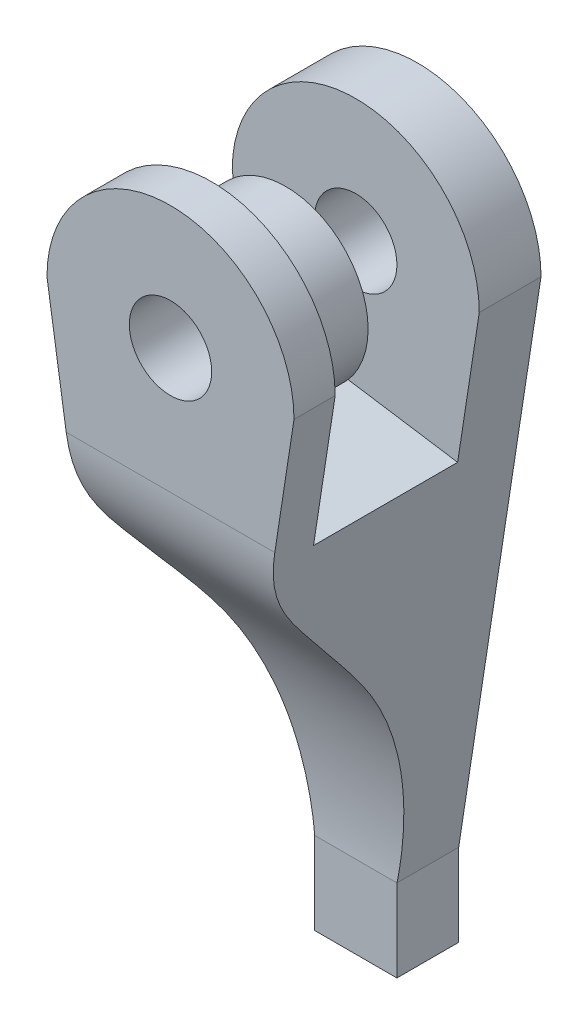
ISO-10303-21;
HEADER;
FILE_DESCRIPTION(('STEP AP214'),'2;1');
FILE_NAME('part.step','',(''),(''),'','','');
FILE_SCHEMA(('AUTOMOTIVE_DESIGN { 1 0 10303 214 1 1 1 1 }'));
ENDSEC;
DATA;
#1=APPLICATION_CONTEXT('core data for automotive mechanical design processes');
#2=APPLICATION_PROTOCOL_DEFINITION('international standard','automotive_design',2000,#1);
#3=PRODUCT_CONTEXT('',#1,'mechanical');
#4=PRODUCT('Part','Part','',(#3));
#5=PRODUCT_RELATED_PRODUCT_CATEGORY('part','',(#4));
#6=PRODUCT_DEFINITION_FORMATION('','',#4);
#7=PRODUCT_DEFINITION_CONTEXT('part definition',#1,'design');
#8=PRODUCT_DEFINITION('design','',#6,#7);
#9=PRODUCT_DEFINITION_SHAPE('','',#8);
#10=(LENGTH_UNIT() NAMED_UNIT(*) SI_UNIT(.MILLI.,.METRE.));
#11=(NAMED_UNIT(*) PLANE_ANGLE_UNIT() SI_UNIT($,.RADIAN.));
#12=(NAMED_UNIT(*) SI_UNIT($,.STERADIAN.) SOLID_ANGLE_UNIT());
#13=UNCERTAINTY_MEASURE_WITH_UNIT(LENGTH_MEASURE(1.E-05),#10,'distance_accuracy_value','');
#14=(GEOMETRIC_REPRESENTATION_CONTEXT(3) GLOBAL_UNCERTAINTY_ASSIGNED_CONTEXT((#13)) GLOBAL_UNIT_ASSIGNED_CONTEXT((#10,
#11,#12)) REPRESENTATION_CONTEXT('',''));
#15=CARTESIAN_POINT('',(0.,0.,0.));
#16=DIRECTION('',(0.,0.,1.));
#17=DIRECTION('',(1.,0.,0.));
#18=AXIS2_PLACEMENT_3D('',#15,#16,#17);
#19=CARTESIAN_POINT('',(0.,0.,25.));
#20=DIRECTION('',(0.,0.,1.));
#21=DIRECTION('',(1.,0.,0.));
#22=AXIS2_PLACEMENT_3D('',#19,#20,#21);
#23=PLANE('',#22);
#24=DIRECTION('',(-0.152057184253941,-0.988371697650617,0.));
#25=VECTOR('',#24,1.);
#26=CARTESIAN_POINT('',(14.6531791907514,-2.25433526011561,25.));
#27=LINE('',#26,#25);
#28=CARTESIAN_POINT('',(15.,0.,25.));
#29=VERTEX_POINT('',#28);
#30=CARTESIAN_POINT('',(12.3723214269423,-17.0799107248749,25.));
#31=VERTEX_POINT('',#30);
#32=EDGE_CURVE('E182',#29,#31,#27,.T.);
#33=ORIENTED_EDGE('',*,*,#32,.T.);
#34=DIRECTION('',(-0.988371697650617,0.152057184253941,0.));
#35=VECTOR('',#34,1.);
#36=CARTESIAN_POINT('',(-2.28085776380912,-14.8255754647593,25.));
#37=LINE('',#36,#35);
#38=CARTESIAN_POINT('',(-12.9721915567335,-13.1807548812324,25.));
#39=VERTEX_POINT('',#38);
#40=EDGE_CURVE('E206',#31,#39,#37,.T.);
#41=ORIENTED_EDGE('',*,*,#40,.T.);
#42=DIRECTION('',(0.152057184253941,-0.988371697650617,0.));
#43=VECTOR('',#42,1.);
#44=CARTESIAN_POINT('',(-14.6531791907514,-2.25433526011561,25.));
#45=LINE('',#44,#43);
#46=CARTESIAN_POINT('',(-15.,0.,25.));
#47=VERTEX_POINT('',#46);
#48=EDGE_CURVE('E201',#47,#39,#45,.T.);
#49=ORIENTED_EDGE('',*,*,#48,.F.);
#50=CARTESIAN_POINT('',(0.,0.,25.));
#51=DIRECTION('',(0.,0.,1.));
#52=DIRECTION('',(1.,0.,0.));
#53=AXIS2_PLACEMENT_3D('',#50,#51,#52);
#54=CIRCLE('',#53,15.);
#55=EDGE_CURVE('E199',#29,#47,#54,.T.);
#56=ORIENTED_EDGE('',*,*,#55,.F.);
#57=EDGE_LOOP('',(#33,#41,#49,#56));
#58=FACE_BOUND('',#57,.T.);
#59=CARTESIAN_POINT('',(0.,0.,25.));
#60=DIRECTION('',(0.,0.,1.));
#61=DIRECTION('',(1.,0.,0.));
#62=AXIS2_PLACEMENT_3D('',#59,#60,#61);
#63=CIRCLE('',#62,10.);
#64=CARTESIAN_POINT('',(10.,0.,25.));
#65=VERTEX_POINT('',#64);
#66=EDGE_CURVE('E13',#65,#65,#63,.F.);
#67=ORIENTED_EDGE('',*,*,#66,.F.);
#68=EDGE_LOOP('',(#67));
#69=FACE_BOUND('',#68,.T.);
#70=ADVANCED_FACE('F45',(#58,#69),#23,.F.);
#71=CARTESIAN_POINT('',(-14.6531791907514,-2.25433526011561,7.5));
#72=DIRECTION('',(0.988371697650617,0.152057184253941,0.));
#73=DIRECTION('',(-0.152057184253941,0.988371697650617,0.));
#74=AXIS2_PLACEMENT_3D('',#71,#72,#73);
#75=PLANE('',#74);
#76=CARTESIAN_POINT('',(-12.6651574370475,-15.1764766591914,30.));
#77=CARTESIAN_POINT('',(-12.6309229013846,-15.3990011410001,30.0000104255594));
#78=CARTESIAN_POINT('',(-12.5966856967954,-15.6215429708296,29.9955409957386));
#79=CARTESIAN_POINT('',(-12.5282575948815,-16.0663256332705,29.9772775209557));
#80=CARTESIAN_POINT('',(-12.4940667172222,-16.2885663380555,29.9634803110557));
#81=CARTESIAN_POINT('',(-12.4258052492918,-16.7322658796032,29.9261953290666));
#82=CARTESIAN_POINT('',(-12.3917346625539,-16.9537246933994,29.9027072746773));
#83=CARTESIAN_POINT('',(-12.3237886074102,-17.3953740518336,29.8457763560617));
#84=CARTESIAN_POINT('',(-12.2899131229269,-17.6155647009749,29.8123343244139));
#85=CARTESIAN_POINT('',(-12.2234103102979,-18.0478329830635,29.7364459358125));
#86=CARTESIAN_POINT('',(-12.1907753322971,-18.2599603400689,29.6942897024932));
#87=CARTESIAN_POINT('',(-12.1258308637561,-18.6820993855851,29.6003945796539));
#88=CARTESIAN_POINT('',(-12.0935213222334,-18.8921114054829,29.5486572165221));
#89=CARTESIAN_POINT('',(-12.0292919525398,-19.3096023084916,29.43567066459));
#90=CARTESIAN_POINT('',(-11.9973720930672,-19.5170813950633,29.3744222452717));
#91=CARTESIAN_POINT('',(-11.9339813595012,-19.9291211632422,29.2426049671905));
#92=CARTESIAN_POINT('',(-11.9025104783418,-20.1336818907782,29.1720362552892));
#93=CARTESIAN_POINT('',(-11.8399035144053,-20.5406271563654,29.0214912831394));
#94=CARTESIAN_POINT('',(-11.8087701123552,-20.7429942696908,28.941466857053));
#95=CARTESIAN_POINT('',(-11.7470480868656,-21.1441874353734,28.7727373912652));
#96=CARTESIAN_POINT('',(-11.7164595355517,-21.3430130189142,28.6840312122483));
#97=CARTESIAN_POINT('',(-11.6558590984265,-21.736915860228,28.4984801162571));
#98=CARTESIAN_POINT('',(-11.6258472216079,-21.9319930595484,28.4016350724915));
#99=CARTESIAN_POINT('',(-11.5664240616299,-22.3182435994059,28.200460367186));
#100=CARTESIAN_POINT('',(-11.5370125671996,-22.5094183132027,28.0961333989162));
#101=CARTESIAN_POINT('',(-11.4784695608721,-22.8899478543314,27.8795092363037));
#102=CARTESIAN_POINT('',(-11.4493442469285,-23.0792623949646,27.7671397567987));
#103=CARTESIAN_POINT('',(-11.3916759039723,-23.4541066241802,27.5361787600556));
#104=CARTESIAN_POINT('',(-11.3631328072633,-23.6396367527886,27.417587971983));
#105=CARTESIAN_POINT('',(-11.3065861696679,-24.0071898971587,27.1749308705608));
#106=CARTESIAN_POINT('',(-11.2785826977351,-24.1892124647218,27.050863864034));
#107=CARTESIAN_POINT('',(-11.2230672924181,-24.5500625992824,26.7980566291622));
#108=CARTESIAN_POINT('',(-11.1955553839472,-24.7288900043431,26.6693161649543));
#109=CARTESIAN_POINT('',(-11.1250500859062,-25.1871744416097,26.3317955004779));
#110=CARTESIAN_POINT('',(-11.0823797442674,-25.4645316622619,26.1201001296326));
#111=CARTESIAN_POINT('',(-11.0189443528452,-25.8768617065062,25.7977154527078));
#112=CARTESIAN_POINT('',(-10.9978924161289,-26.0136992951621,25.6894372210239));
#113=CARTESIAN_POINT('',(-10.9559321332563,-26.2864411338341,25.4716822365074));
#114=CARTESIAN_POINT('',(-10.9350237870021,-26.4223453844863,25.3622054844916));
#115=CARTESIAN_POINT('',(-10.8933024189929,-26.6935342765463,25.1425093156595));
#116=CARTESIAN_POINT('',(-10.8724893849346,-26.828818997925,25.0322899995101));
#117=CARTESIAN_POINT('',(-10.8309072519762,-27.099102862155,24.8114940224908));
#118=CARTESIAN_POINT('',(-10.8101381530034,-27.2341020054778,24.7009173622114));
#119=CARTESIAN_POINT('',(-10.7686462857886,-27.5037991423739,24.47940896942));
#120=CARTESIAN_POINT('',(-10.7479235142877,-27.6384971571297,24.3684772633092));
#121=CARTESIAN_POINT('',(-10.7065190013784,-27.9076264910401,24.1462834214081));
#122=CARTESIAN_POINT('',(-10.6858372599469,-28.0420578103449,24.035021285804));
#123=CARTESIAN_POINT('',(-10.6238196630834,-28.4451721899577,23.7006154658293));
#124=CARTESIAN_POINT('',(-10.5825411940378,-28.7134822387543,23.4770113612894));
#125=CARTESIAN_POINT('',(-10.5001083245377,-29.2492958905052,23.0288079797156));
#126=CARTESIAN_POINT('',(-10.4589539261535,-29.5167994800022,22.804208686228));
#127=CARTESIAN_POINT('',(-10.3766959049752,-30.0514766176614,22.354061438841));
#128=CARTESIAN_POINT('',(-10.3355923736116,-30.3186495715244,22.12851276276));
#129=CARTESIAN_POINT('',(-10.2534389301924,-30.8526469537492,21.6769959736275));
#130=CARTESIAN_POINT('',(-10.2123890179354,-31.1194713834201,21.4510278621592));
#131=CARTESIAN_POINT('',(-10.1302474817904,-31.6533913683621,20.99873624199));
#132=CARTESIAN_POINT('',(-10.0891558696047,-31.9204868475692,20.772412641092));
#133=CARTESIAN_POINT('',(-10.0069311624002,-32.454947444399,20.3200916656417));
#134=CARTESIAN_POINT('',(-9.96579806733101,-32.7223125623485,20.0940942914856));
#135=CARTESIAN_POINT('',(-9.84213215886628,-33.5261409673692,19.4165830604753));
#136=CARTESIAN_POINT('',(-9.75945303342924,-34.0635552827099,18.9662168320071));
#137=CARTESIAN_POINT('',(-9.5942250569529,-35.1375371298061,18.0785817440321));
#138=CARTESIAN_POINT('',(-9.51168789464864,-35.6740286847839,17.6412191808639));
#139=CARTESIAN_POINT('',(-9.34506239736745,-36.7570944171115,16.7789838443693));
#140=CARTESIAN_POINT('',(-9.26097360194631,-37.303671587349,16.3541148787525));
#141=CARTESIAN_POINT('',(-9.13324216415133,-38.1339259330164,15.7317504802914));
#142=CARTESIAN_POINT('',(-9.09042701209726,-38.4122244213678,15.5269139144095));
#143=CARTESIAN_POINT('',(-9.00415942117633,-38.9729637623538,15.1231185972565));
#144=CARTESIAN_POINT('',(-8.96070699617631,-39.255404524854,14.9241597183722));
#145=CARTESIAN_POINT('',(-8.89502613643056,-39.6823301132014,14.6311410218222));
#146=CARTESIAN_POINT('',(-8.87306824536463,-39.8250564051299,14.5344536337974));
#147=CARTESIAN_POINT('',(-8.82896779264746,-40.1117093477915,14.3429179941947));
#148=CARTESIAN_POINT('',(-8.80682523087647,-40.255635999303,14.2480697438095));
#149=CARTESIAN_POINT('',(-8.74012731594618,-40.6891724463498,13.9662852397961));
#150=CARTESIAN_POINT('',(-8.69530147279287,-40.9805404268464,13.7821080713406));
#151=CARTESIAN_POINT('',(-8.60501034519747,-41.5674327562165,13.4214546106705));
#152=CARTESIAN_POINT('',(-8.55954586006673,-41.8629519095663,13.2449696602624));
#153=CARTESIAN_POINT('',(-8.46795782064304,-42.4582741658202,12.899573908218));
#154=CARTESIAN_POINT('',(-8.42183426477593,-42.7580772789565,12.7306631246762));
#155=CARTESIAN_POINT('',(-8.28255801120975,-43.6633729271366,12.2355640563298));
#156=CARTESIAN_POINT('',(-8.18845482441539,-44.2750436413,11.9208297517456));
#157=CARTESIAN_POINT('',(-8.01604016563454,-45.3957389233755,11.3792455240864));
#158=CARTESIAN_POINT('',(-7.93811485997689,-45.9022534101502,11.1470427935834));
#159=CARTESIAN_POINT('',(-7.7808491348492,-46.9244806234802,10.703121373699));
#160=CARTESIAN_POINT('',(-7.70150761009294,-47.4402005343959,10.4914195934451));
#161=CARTESIAN_POINT('',(-7.54159169491173,-48.4796539830737,10.0888058500821));
#162=CARTESIAN_POINT('',(-7.46101698906223,-49.0033895710955,9.89789931089816));
#163=CARTESIAN_POINT('',(-7.29832140237487,-50.0609108845634,9.535972252223));
#164=CARTESIAN_POINT('',(-7.21619426990896,-50.5947372455918,9.36507328967339));
#165=CARTESIAN_POINT('',(-7.05101777044317,-51.6683844921194,9.04455895703785));
#166=CARTESIAN_POINT('',(-6.96796874099825,-52.2082031835114,8.89493605687927));
#167=CARTESIAN_POINT('',(-6.80107095809108,-53.293038772408,8.6169797271204));
#168=CARTESIAN_POINT('',(-6.71722239694794,-53.8380544198385,8.48864130787825));
#169=CARTESIAN_POINT('',(-6.56657268444818,-54.8172775510869,8.27808581887361));
#170=CARTESIAN_POINT('',(-6.49990069665785,-55.250645471724,8.19184790735053));
#171=CARTESIAN_POINT('',(-6.36618862801504,-56.1197739179023,8.03274210915712));
#172=CARTESIAN_POINT('',(-6.2991485497075,-56.5555344269013,7.95987413016807));
#173=CARTESIAN_POINT('',(-6.16489785168642,-57.4281639640383,7.82777982814137));
#174=CARTESIAN_POINT('',(-6.09768785637851,-57.8650289335397,7.7685260543494));
#175=CARTESIAN_POINT('',(-5.96302165895253,-58.7403592168086,7.66370145921284));
#176=CARTESIAN_POINT('',(-5.89556545907953,-59.1788245159831,7.6181305134121));
#177=CARTESIAN_POINT('',(-5.75939981419934,-60.0639012077043,7.54045760257651));
#178=CARTESIAN_POINT('',(-5.69068740758586,-60.5105318506919,7.50857982208973));
#179=CARTESIAN_POINT('',(-5.55312027983909,-61.4047181810459,7.46004039294758));
#180=CARTESIAN_POINT('',(-5.48426553197717,-61.8522740421484,7.44338192402294));
#181=CARTESIAN_POINT('',(-5.38078912226615,-62.52487070527,7.43084491072538));
#182=CARTESIAN_POINT('',(-5.34618310881751,-62.7498097926862,7.42875086177981));
#183=CARTESIAN_POINT('',(-5.27697581772415,-63.199657184793,7.4290797663929));
#184=CARTESIAN_POINT('',(-5.24237454018566,-63.4245654887932,7.43150201323426));
#185=CARTESIAN_POINT('',(-5.1904524420599,-63.7620591266106,7.43892103717431));
#186=CARTESIAN_POINT('',(-5.17312504424518,-63.8746872124063,7.44202980294997));
#187=CARTESIAN_POINT('',(-5.13847730679174,-64.0998975058537,7.4496225068762));
#188=CARTESIAN_POINT('',(-5.12115696703018,-64.2124797143038,7.45410641997236));
#189=CARTESIAN_POINT('',(-5.09518236895227,-64.3813146018103,7.46198364601045));
#190=CARTESIAN_POINT('',(-5.08652401323701,-64.4375939139594,7.46480172842067));
#191=CARTESIAN_POINT('',(-5.06921059020001,-64.5501311636999,7.47085067227776));
#192=CARTESIAN_POINT('',(-5.06055552288229,-64.6063891012651,7.4740815342285));
#193=CARTESIAN_POINT('',(-5.04757588258112,-64.6907567632227,7.47925989830149));
#194=CARTESIAN_POINT('',(-5.04324976561141,-64.7188765235258,7.48104139351356));
#195=CARTESIAN_POINT('',(-5.03459861383483,-64.7751090100736,7.48471701614256));
#196=CARTESIAN_POINT('',(-5.0302735790336,-64.8032217362816,7.48661114413404));
#197=CARTESIAN_POINT('',(-5.023786850539,-64.8453854714965,7.48953130077695));
#198=CARTESIAN_POINT('',(-5.02162474468496,-64.8594391595478,7.49051784724627));
#199=CARTESIAN_POINT('',(-5.01730074962156,-64.8875451274599,7.49251026660246));
#200=CARTESIAN_POINT('',(-5.0151388604117,-64.901597407324,7.49351613944462));
#201=CARTESIAN_POINT('',(-5.01081518370422,-64.9297013059225,7.4955397326945));
#202=CARTESIAN_POINT('',(-5.0086533962069,-64.9437529246552,7.49655745313388));
#203=CARTESIAN_POINT('',(-5.00541013744108,-64.964834106633,7.49802792885024));
#204=CARTESIAN_POINT('',(-5.00432893944892,-64.9718618935821,7.49850874308072));
#205=CARTESIAN_POINT('',(-5.00270666592642,-64.9824066714783,7.49919299636495));
#206=CARTESIAN_POINT('',(-5.00216581054672,-64.9859222314464,7.49941492626098));
#207=CARTESIAN_POINT('',(-5.0010834687422,-64.9929574531757,7.49978159809259));
#208=CARTESIAN_POINT('',(-5.00054198225216,-64.996477115361,7.49992633117814));
#209=CARTESIAN_POINT('',(-5.,-65.,7.5));
#210=B_SPLINE_CURVE_WITH_KNOTS('',3,(#76,#77,#78,#79,#80,#81,#82,#83,#84,#85,#86,#87,#88,#89,
#90,#91,#92,#93,#94,#95,#96,#97,#98,#99,#100,#101,#102,#103,#104,#105,#106,#107,#108,#109,#110,
#111,#112,#113,#114,#115,#116,#117,#118,#119,#120,#121,#122,#123,#124,#125,#126,#127,#128,#129,
#130,#131,#132,#133,#134,#135,#136,#137,#138,#139,#140,#141,#142,#143,#144,#145,#146,#147,#148,
#149,#150,#151,#152,#153,#154,#155,#156,#157,#158,#159,#160,#161,#162,#163,#164,#165,#166,#167,
#168,#169,#170,#171,#172,#173,#174,#175,#176,#177,#178,#179,#180,#181,#182,#183,#184,#185,#186,
#187,#188,#189,#190,#191,#192,#193,#194,#195,#196,#197,#198,#199,#200,#201,#202,#203,#204,#205,
#206,#207,#208,#209),.UNSPECIFIED.,.F.,.F.,(4,2,2,2,2,2,2,2,2,2,2,2,2,2,2,2,2,2,2,2,2,2,2,2,2,2,
2,2,2,2,2,2,2,2,2,2,2,2,2,2,2,2,2,2,2,2,2,2,2,2,2,2,2,2,2,2,2,2,2,2,2,2,2,2,2,2,4),(0.,
0.675408891084485,1.3510470651044,2.02670492227246,2.70230628139759,3.35826129363197,
4.01411189416948,4.66990946142085,5.32569669636945,5.98498142795723,6.64435279447188,
7.30373443491825,7.9628798976058,8.62895777775243,9.29495776421723,9.96104229575337,
10.6271604904897,11.6815355263539,12.2088157998764,12.7360957140734,13.2633055300427,
13.7905144749935,14.317685087591,14.8448554033325,15.8999524841815,16.9550670748103,
18.0112328164686,19.067394579573,20.1248713469618,21.1823493971612,23.3004095504111,
25.3915618424128,27.4833449907791,28.5278785915537,29.572389497266,30.093733372283,
30.6150775853767,31.6577598052061,32.6992363829475,33.7407154486271,35.8226383027109,
37.510096777553,39.1989354162617,40.8882134973805,42.5872737919229,44.2857312464387,
45.9837899733394,47.3241941790219,48.6645891289297,50.0022572040358,51.3399131116238,
52.6987038319142,54.0577783758972,54.7405298769556,55.4231745489171,55.7651550738553,
56.1071293684732,56.2781616388498,56.4491941179984,56.534712874883,56.6202320680415,
56.6629916767677,56.7057511865492,56.7485108105844,56.7698912348154,56.7805821628465,
56.7912743162461),.UNSPECIFIED.);
#211=CARTESIAN_POINT('',(-12.6651574370475,-15.1764766591914,30.));
#212=VERTEX_POINT('',#211);
#213=CARTESIAN_POINT('',(-5.,-65.,7.5));
#214=VERTEX_POINT('',#213);
#215=EDGE_CURVE('E131',#212,#214,#210,.T.);
#216=ORIENTED_EDGE('',*,*,#215,.F.);
#217=DIRECTION('',(0.152057184253941,-0.988371697650617,0.));
#218=VECTOR('',#217,1.);
#219=CARTESIAN_POINT('',(-14.6531791907514,-2.25433526011561,30.));
#220=LINE('',#219,#218);
#221=CARTESIAN_POINT('',(-15.,0.,30.));
#222=VERTEX_POINT('',#221);
#223=EDGE_CURVE('E180',#222,#212,#220,.T.);
#224=ORIENTED_EDGE('',*,*,#223,.F.);
#225=DIRECTION('',(0.,0.,-1.));
#226=VECTOR('',#225,1.);
#227=CARTESIAN_POINT('',(-15.,0.,30.));
#228=LINE('',#227,#226);
#229=EDGE_CURVE('E192',#222,#47,#228,.T.);
#230=ORIENTED_EDGE('',*,*,#229,.T.);
#231=ORIENTED_EDGE('',*,*,#48,.T.);
#232=DIRECTION('',(0.,0.,1.));
#233=VECTOR('',#232,1.);
#234=CARTESIAN_POINT('',(-12.9721915567335,-13.1807548812324,-50.1851670974318));
#235=LINE('',#234,#233);
#236=CARTESIAN_POINT('',(-12.9721915567335,-13.1807548812324,7.5));
#237=VERTEX_POINT('',#236);
#238=EDGE_CURVE('E212',#237,#39,#235,.T.);
#239=ORIENTED_EDGE('',*,*,#238,.F.);
#240=DIRECTION('',(0.152057184253941,-0.988371697650617,0.));
#241=VECTOR('',#240,1.);
#242=CARTESIAN_POINT('',(-14.6531791907514,-2.25433526011561,7.5));
#243=LINE('',#242,#241);
#244=CARTESIAN_POINT('',(-15.,0.,7.5));
#245=VERTEX_POINT('',#244);
#246=EDGE_CURVE('E215',#245,#237,#243,.T.);
#247=ORIENTED_EDGE('',*,*,#246,.F.);
#248=DIRECTION('',(0.,0.,-1.));
#249=VECTOR('',#248,1.);
#250=CARTESIAN_POINT('',(-15.,0.,7.5));
#251=LINE('',#250,#249);
#252=CARTESIAN_POINT('',(-15.,0.,0.));
#253=VERTEX_POINT('',#252);
#254=EDGE_CURVE('E166',#245,#253,#251,.T.);
#255=ORIENTED_EDGE('',*,*,#254,.T.);
#256=DIRECTION('',(0.152057184253941,-0.988371697650617,0.));
#257=VECTOR('',#256,1.);
#258=CARTESIAN_POINT('',(-14.6531791907514,-2.25433526011561,0.));
#259=LINE('',#258,#257);
#260=CARTESIAN_POINT('',(-5.,-65.,0.));
#261=VERTEX_POINT('',#260);
#262=EDGE_CURVE('E209',#253,#261,#259,.T.);
#263=ORIENTED_EDGE('',*,*,#262,.T.);
#264=DIRECTION('',(0.,0.,-1.));
#265=VECTOR('',#264,1.);
#266=CARTESIAN_POINT('',(-5.,-65.,7.5));
#267=LINE('',#266,#265);
#268=EDGE_CURVE('E172',#214,#261,#267,.T.);
#269=ORIENTED_EDGE('',*,*,#268,.F.);
#270=EDGE_LOOP('',(#216,#224,#230,#231,#239,#247,#255,#263,#269));
#271=FACE_BOUND('',#270,.T.);
#272=ADVANCED_FACE('F47',(#271),#75,.F.);
#273=CARTESIAN_POINT('',(14.6531791907514,-2.25433526011561,7.5));
#274=DIRECTION('',(0.988371697650617,-0.152057184253941,0.));
#275=DIRECTION('',(0.152057184253941,0.988371697650617,0.));
#276=AXIS2_PLACEMENT_3D('',#273,#274,#275);
#277=PLANE('',#276);
#278=DIRECTION('',(-0.152057184253941,-0.988371697650617,0.));
#279=VECTOR('',#278,1.);
#280=CARTESIAN_POINT('',(14.6531791907514,-2.25433526011561,30.));
#281=LINE('',#280,#279);
#282=CARTESIAN_POINT('',(15.,0.,30.));
#283=VERTEX_POINT('',#282);
#284=CARTESIAN_POINT('',(12.6651574370475,-15.1764766591914,30.));
#285=VERTEX_POINT('',#284);
#286=EDGE_CURVE('E145',#283,#285,#281,.T.);
#287=ORIENTED_EDGE('',*,*,#286,.T.);
#288=CARTESIAN_POINT('',(12.6651574370475,-15.1764766591914,30.));
#289=CARTESIAN_POINT('',(12.6309229013846,-15.3990011410001,30.0000104255594));
#290=CARTESIAN_POINT('',(12.5966856967954,-15.6215429708296,29.9955409957386));
#291=CARTESIAN_POINT('',(12.5282575948815,-16.0663256332705,29.9772775209557));
#292=CARTESIAN_POINT('',(12.4940667172222,-16.2885663380555,29.9634803110557));
#293=CARTESIAN_POINT('',(12.4258052492918,-16.7322658796032,29.9261953290666));
#294=CARTESIAN_POINT('',(12.3917346625539,-16.9537246933994,29.9027072746773));
#295=CARTESIAN_POINT('',(12.3237886074102,-17.3953740518336,29.8457763560617));
#296=CARTESIAN_POINT('',(12.2899131229269,-17.6155647009749,29.8123343244139));
#297=CARTESIAN_POINT('',(12.2234103102979,-18.0478329830635,29.7364459358125));
#298=CARTESIAN_POINT('',(12.1907753322971,-18.2599603400689,29.6942897024932));
#299=CARTESIAN_POINT('',(12.1258308637561,-18.6820993855851,29.6003945796539));
#300=CARTESIAN_POINT('',(12.0935213222334,-18.8921114054829,29.5486572165221));
#301=CARTESIAN_POINT('',(12.0292919525398,-19.3096023084916,29.43567066459));
#302=CARTESIAN_POINT('',(11.9973720930672,-19.5170813950633,29.3744222452717));
#303=CARTESIAN_POINT('',(11.9339813595012,-19.9291211632422,29.2426049671905));
#304=CARTESIAN_POINT('',(11.9025104783418,-20.1336818907782,29.1720362552892));
#305=CARTESIAN_POINT('',(11.8399035144053,-20.5406271563654,29.0214912831394));
#306=CARTESIAN_POINT('',(11.8087701123552,-20.7429942696908,28.941466857053));
#307=CARTESIAN_POINT('',(11.7470480868656,-21.1441874353734,28.7727373912652));
#308=CARTESIAN_POINT('',(11.7164595355517,-21.3430130189142,28.6840312122483));
#309=CARTESIAN_POINT('',(11.6558590984265,-21.736915860228,28.4984801162571));
#310=CARTESIAN_POINT('',(11.6258472216079,-21.9319930595484,28.4016350724915));
#311=CARTESIAN_POINT('',(11.5664240616299,-22.3182435994059,28.200460367186));
#312=CARTESIAN_POINT('',(11.5370125671996,-22.5094183132027,28.0961333989162));
#313=CARTESIAN_POINT('',(11.4784695608721,-22.8899478543314,27.8795092363037));
#314=CARTESIAN_POINT('',(11.4493442469285,-23.0792623949646,27.7671397567987));
#315=CARTESIAN_POINT('',(11.3916759039723,-23.4541066241802,27.5361787600556));
#316=CARTESIAN_POINT('',(11.3631328072633,-23.6396367527886,27.417587971983));
#317=CARTESIAN_POINT('',(11.3065861696679,-24.0071898971587,27.1749308705608));
#318=CARTESIAN_POINT('',(11.2785826977351,-24.1892124647218,27.050863864034));
#319=CARTESIAN_POINT('',(11.2230672924181,-24.5500625992824,26.7980566291622));
#320=CARTESIAN_POINT('',(11.1955553839472,-24.7288900043431,26.6693161649543));
#321=CARTESIAN_POINT('',(11.1250500859062,-25.1871744416097,26.3317955004779));
#322=CARTESIAN_POINT('',(11.0823797442674,-25.4645316622619,26.1201001296326));
#323=CARTESIAN_POINT('',(11.0189443528452,-25.8768617065062,25.7977154527078));
#324=CARTESIAN_POINT('',(10.9978924161289,-26.013699295162,25.6894372210239));
#325=CARTESIAN_POINT('',(10.9559321332563,-26.2864411338341,25.4716822365074));
#326=CARTESIAN_POINT('',(10.9350237870021,-26.4223453844863,25.3622054844916));
#327=CARTESIAN_POINT('',(10.8933024189929,-26.6935342765463,25.1425093156595));
#328=CARTESIAN_POINT('',(10.8724893849346,-26.828818997925,25.0322899995101));
#329=CARTESIAN_POINT('',(10.8309072519762,-27.099102862155,24.8114940224908));
#330=CARTESIAN_POINT('',(10.8101381530034,-27.2341020054778,24.7009173622114));
#331=CARTESIAN_POINT('',(10.7686462857886,-27.5037991423739,24.47940896942));
#332=CARTESIAN_POINT('',(10.7479235142877,-27.6384971571297,24.3684772633092));
#333=CARTESIAN_POINT('',(10.7065190013784,-27.9076264910401,24.1462834214081));
#334=CARTESIAN_POINT('',(10.6858372599469,-28.0420578103449,24.035021285804));
#335=CARTESIAN_POINT('',(10.6238196630834,-28.4451721899577,23.7006154658293));
#336=CARTESIAN_POINT('',(10.5825411940378,-28.7134822387543,23.4770113612894));
#337=CARTESIAN_POINT('',(10.5001083245377,-29.2492958905052,23.0288079797156));
#338=CARTESIAN_POINT('',(10.4589539261535,-29.5167994800022,22.804208686228));
#339=CARTESIAN_POINT('',(10.3766959049752,-30.0514766176614,22.354061438841));
#340=CARTESIAN_POINT('',(10.3355923736116,-30.3186495715244,22.12851276276));
#341=CARTESIAN_POINT('',(10.2534389301924,-30.8526469537492,21.6769959736275));
#342=CARTESIAN_POINT('',(10.2123890179354,-31.1194713834201,21.4510278621592));
#343=CARTESIAN_POINT('',(10.1302474817904,-31.6533913683621,20.99873624199));
#344=CARTESIAN_POINT('',(10.0891558696047,-31.9204868475692,20.772412641092));
#345=CARTESIAN_POINT('',(10.0069311624002,-32.454947444399,20.3200916656417));
#346=CARTESIAN_POINT('',(9.96579806733101,-32.7223125623485,20.0940942914856));
#347=CARTESIAN_POINT('',(9.84213215886628,-33.5261409673692,19.4165830604753));
#348=CARTESIAN_POINT('',(9.75945303342924,-34.06355528271,18.9662168320071));
#349=CARTESIAN_POINT('',(9.5942250569529,-35.1375371298061,18.0785817440321));
#350=CARTESIAN_POINT('',(9.51168789464864,-35.6740286847839,17.6412191808639));
#351=CARTESIAN_POINT('',(9.34506239736746,-36.7570944171116,16.7789838443693));
#352=CARTESIAN_POINT('',(9.2609736019463,-37.303671587349,16.3541148787525));
#353=CARTESIAN_POINT('',(9.13324216415132,-38.1339259330164,15.7317504802914));
#354=CARTESIAN_POINT('',(9.09042701209726,-38.4122244213678,15.5269139144095));
#355=CARTESIAN_POINT('',(9.00415942117633,-38.9729637623538,15.1231185972565));
#356=CARTESIAN_POINT('',(8.96070699617631,-39.255404524854,14.9241597183722));
#357=CARTESIAN_POINT('',(8.89502613643056,-39.6823301132014,14.6311410218222));
#358=CARTESIAN_POINT('',(8.87306824536463,-39.8250564051299,14.5344536337974));
#359=CARTESIAN_POINT('',(8.82896779264746,-40.1117093477915,14.3429179941947));
#360=CARTESIAN_POINT('',(8.80682523087647,-40.255635999303,14.2480697438095));
#361=CARTESIAN_POINT('',(8.74012731594618,-40.6891724463498,13.9662852397961));
#362=CARTESIAN_POINT('',(8.69530147279287,-40.9805404268464,13.7821080713406));
#363=CARTESIAN_POINT('',(8.60501034519747,-41.5674327562165,13.4214546106705));
#364=CARTESIAN_POINT('',(8.55954586006673,-41.8629519095663,13.2449696602624));
#365=CARTESIAN_POINT('',(8.46795782064304,-42.4582741658202,12.899573908218));
#366=CARTESIAN_POINT('',(8.42183426477593,-42.7580772789565,12.7306631246762));
#367=CARTESIAN_POINT('',(8.28255801120975,-43.6633729271366,12.2355640563298));
#368=CARTESIAN_POINT('',(8.18845482441539,-44.2750436413,11.9208297517456));
#369=CARTESIAN_POINT('',(8.01604016563455,-45.3957389233755,11.3792455240864));
#370=CARTESIAN_POINT('',(7.93811485997689,-45.9022534101502,11.1470427935834));
#371=CARTESIAN_POINT('',(7.7808491348492,-46.9244806234802,10.703121373699));
#372=CARTESIAN_POINT('',(7.70150761009294,-47.4402005343959,10.4914195934451));
#373=CARTESIAN_POINT('',(7.54159169491173,-48.4796539830737,10.0888058500821));
#374=CARTESIAN_POINT('',(7.46101698906223,-49.0033895710955,9.89789931089817));
#375=CARTESIAN_POINT('',(7.29832140237487,-50.0609108845634,9.53597225222301));
#376=CARTESIAN_POINT('',(7.21619426990896,-50.5947372455918,9.3650732896734));
#377=CARTESIAN_POINT('',(7.05101777044317,-51.6683844921194,9.04455895703785));
#378=CARTESIAN_POINT('',(6.96796874099826,-52.2082031835113,8.89493605687927));
#379=CARTESIAN_POINT('',(6.80107095809108,-53.293038772408,8.61697972712041));
#380=CARTESIAN_POINT('',(6.71722239694793,-53.8380544198384,8.48864130787826));
#381=CARTESIAN_POINT('',(6.56657268444818,-54.8172775510868,8.27808581887362));
#382=CARTESIAN_POINT('',(6.49990069665785,-55.250645471724,8.19184790735053));
#383=CARTESIAN_POINT('',(6.36618862801504,-56.1197739179022,8.03274210915713));
#384=CARTESIAN_POINT('',(6.2991485497075,-56.5555344269013,7.95987413016807));
#385=CARTESIAN_POINT('',(6.16489785168642,-57.4281639640383,7.82777982814137));
#386=CARTESIAN_POINT('',(6.09768785637851,-57.8650289335397,7.76852605434941));
#387=CARTESIAN_POINT('',(5.96302165895253,-58.7403592168085,7.66370145921285));
#388=CARTESIAN_POINT('',(5.89556545907953,-59.178824515983,7.61813051341211));
#389=CARTESIAN_POINT('',(5.75939981419935,-60.0639012077043,7.54045760257652));
#390=CARTESIAN_POINT('',(5.69068740758586,-60.5105318506919,7.50857982208973));
#391=CARTESIAN_POINT('',(5.55312027983909,-61.4047181810459,7.46004039294758));
#392=CARTESIAN_POINT('',(5.48426553197717,-61.8522740421484,7.44338192402294));
#393=CARTESIAN_POINT('',(5.38078912226615,-62.52487070527,7.43084491072538));
#394=CARTESIAN_POINT('',(5.34618310881752,-62.7498097926862,7.42875086177981));
#395=CARTESIAN_POINT('',(5.27697581772415,-63.199657184793,7.4290797663929));
#396=CARTESIAN_POINT('',(5.24237454018566,-63.4245654887932,7.43150201323427));
#397=CARTESIAN_POINT('',(5.1904524420599,-63.7620591266107,7.43892103717431));
#398=CARTESIAN_POINT('',(5.17312504424518,-63.8746872124064,7.44202980294997));
#399=CARTESIAN_POINT('',(5.13847730679174,-64.0998975058537,7.4496225068762));
#400=CARTESIAN_POINT('',(5.12115696703018,-64.2124797143038,7.45410641997236));
#401=CARTESIAN_POINT('',(5.09518236895227,-64.3813146018103,7.46198364601045));
#402=CARTESIAN_POINT('',(5.08652401323701,-64.4375939139594,7.46480172842066));
#403=CARTESIAN_POINT('',(5.06921059020001,-64.5501311636999,7.47085067227776));
#404=CARTESIAN_POINT('',(5.06055552288229,-64.6063891012651,7.4740815342285));
#405=CARTESIAN_POINT('',(5.04757588258112,-64.6907567632227,7.47925989830149));
#406=CARTESIAN_POINT('',(5.04324976561141,-64.7188765235258,7.48104139351356));
#407=CARTESIAN_POINT('',(5.03459861383483,-64.7751090100736,7.48471701614256));
#408=CARTESIAN_POINT('',(5.03027357903359,-64.8032217362816,7.48661114413404));
#409=CARTESIAN_POINT('',(5.02378685053899,-64.8453854714965,7.48953130077695));
#410=CARTESIAN_POINT('',(5.02162474468496,-64.8594391595478,7.49051784724627));
#411=CARTESIAN_POINT('',(5.01730074962156,-64.8875451274599,7.49251026660246));
#412=CARTESIAN_POINT('',(5.0151388604117,-64.901597407324,7.49351613944462));
#413=CARTESIAN_POINT('',(5.01081518370422,-64.9297013059225,7.4955397326945));
#414=CARTESIAN_POINT('',(5.0086533962069,-64.9437529246552,7.49655745313387));
#415=CARTESIAN_POINT('',(5.00541013744108,-64.964834106633,7.49802792885024));
#416=CARTESIAN_POINT('',(5.00432893944892,-64.9718618935821,7.49850874308072));
#417=CARTESIAN_POINT('',(5.00270666592642,-64.9824066714783,7.49919299636495));
#418=CARTESIAN_POINT('',(5.00216581054672,-64.9859222314464,7.49941492626098));
#419=CARTESIAN_POINT('',(5.0010834687422,-64.9929574531757,7.49978159809258));
#420=CARTESIAN_POINT('',(5.00054198225216,-64.996477115361,7.49992633117813));
#421=CARTESIAN_POINT('',(5.,-65.,7.5));
#422=B_SPLINE_CURVE_WITH_KNOTS('',3,(#288,#289,#290,#291,#292,#293,#294,#295,#296,#297,#298,
#299,#300,#301,#302,#303,#304,#305,#306,#307,#308,#309,#310,#311,#312,#313,#314,#315,#316,#317,
#318,#319,#320,#321,#322,#323,#324,#325,#326,#327,#328,#329,#330,#331,#332,#333,#334,#335,#336,
#337,#338,#339,#340,#341,#342,#343,#344,#345,#346,#347,#348,#349,#350,#351,#352,#353,#354,#355,
#356,#357,#358,#359,#360,#361,#362,#363,#364,#365,#366,#367,#368,#369,#370,#371,#372,#373,#374,
#375,#376,#377,#378,#379,#380,#381,#382,#383,#384,#385,#386,#387,#388,#389,#390,#391,#392,#393,
#394,#395,#396,#397,#398,#399,#400,#401,#402,#403,#404,#405,#406,#407,#408,#409,#410,#411,#412,
#413,#414,#415,#416,#417,#418,#419,#420,#421),.UNSPECIFIED.,.F.,.F.,(4,2,2,2,2,2,2,2,2,2,2,2,2,
2,2,2,2,2,2,2,2,2,2,2,2,2,2,2,2,2,2,2,2,2,2,2,2,2,2,2,2,2,2,2,2,2,2,2,2,2,2,2,2,2,2,2,2,2,2,2,2,
2,2,2,2,2,4),(0.,0.675408891084485,1.3510470651044,2.02670492227246,2.70230628139759,
3.35826129363197,4.01411189416948,4.66990946142085,5.32569669636945,5.98498142795723,
6.64435279447188,7.30373443491825,7.9628798976058,8.62895777775243,9.29495776421723,
9.96104229575337,10.6271604904897,11.6815355263539,12.2088157998764,12.7360957140734,
13.2633055300427,13.7905144749935,14.317685087591,14.8448554033325,15.8999524841815,
16.9550670748103,18.0112328164686,19.067394579573,20.1248713469618,21.1823493971612,
23.3004095504111,25.3915618424128,27.4833449907791,28.5278785915536,29.572389497266,
30.093733372283,30.6150775853767,31.6577598052061,32.6992363829475,33.7407154486271,
35.8226383027109,37.510096777553,39.1989354162617,40.8882134973805,42.5872737919229,
44.2857312464387,45.9837899733393,47.3241941790219,48.6645891289296,50.0022572040358,
51.3399131116238,52.6987038319142,54.0577783758972,54.7405298769556,55.4231745489171,
55.7651550738553,56.1071293684731,56.2781616388497,56.4491941179984,56.5347128748829,
56.6202320680415,56.6629916767677,56.7057511865492,56.7485108105844,56.7698912348154,
56.7805821628464,56.791274316246),.UNSPECIFIED.);
#423=CARTESIAN_POINT('',(5.,-65.,7.5));
#424=VERTEX_POINT('',#423);
#425=EDGE_CURVE('E61',#285,#424,#422,.T.);
#426=ORIENTED_EDGE('',*,*,#425,.T.);
#427=DIRECTION('',(0.,0.,-1.));
#428=VECTOR('',#427,1.);
#429=CARTESIAN_POINT('',(5.,-65.,7.5));
#430=LINE('',#429,#428);
#431=CARTESIAN_POINT('',(5.,-65.,0.));
#432=VERTEX_POINT('',#431);
#433=EDGE_CURVE('E142',#424,#432,#430,.T.);
#434=ORIENTED_EDGE('',*,*,#433,.T.);
#435=DIRECTION('',(-0.152057184253941,-0.988371697650617,0.));
#436=VECTOR('',#435,1.);
#437=CARTESIAN_POINT('',(14.6531791907514,-2.25433526011561,0.));
#438=LINE('',#437,#436);
#439=CARTESIAN_POINT('',(15.,0.,0.));
#440=VERTEX_POINT('',#439);
#441=EDGE_CURVE('E234',#440,#432,#438,.T.);
#442=ORIENTED_EDGE('',*,*,#441,.F.);
#443=DIRECTION('',(0.,0.,-1.));
#444=VECTOR('',#443,1.);
#445=CARTESIAN_POINT('',(15.,0.,7.5));
#446=LINE('',#445,#444);
#447=CARTESIAN_POINT('',(15.,0.,7.5));
#448=VERTEX_POINT('',#447);
#449=EDGE_CURVE('E162',#448,#440,#446,.T.);
#450=ORIENTED_EDGE('',*,*,#449,.F.);
#451=DIRECTION('',(-0.152057184253941,-0.988371697650617,0.));
#452=VECTOR('',#451,1.);
#453=CARTESIAN_POINT('',(14.6531791907514,-2.25433526011561,7.5));
#454=LINE('',#453,#452);
#455=CARTESIAN_POINT('',(12.3723214269423,-17.0799107248749,7.5));
#456=VERTEX_POINT('',#455);
#457=EDGE_CURVE('E155',#448,#456,#454,.T.);
#458=ORIENTED_EDGE('',*,*,#457,.T.);
#459=DIRECTION('',(0.,0.,1.));
#460=VECTOR('',#459,1.);
#461=CARTESIAN_POINT('',(12.3723214269423,-17.0799107248749,-50.1851670974318));
#462=LINE('',#461,#460);
#463=EDGE_CURVE('E135',#456,#31,#462,.T.);
#464=ORIENTED_EDGE('',*,*,#463,.T.);
#465=ORIENTED_EDGE('',*,*,#32,.F.);
#466=DIRECTION('',(0.,0.,-1.));
#467=VECTOR('',#466,1.);
#468=CARTESIAN_POINT('',(15.,0.,30.));
#469=LINE('',#468,#467);
#470=EDGE_CURVE('E205',#283,#29,#469,.T.);
#471=ORIENTED_EDGE('',*,*,#470,.F.);
#472=EDGE_LOOP('',(#287,#426,#434,#442,#450,#458,#464,#465,#471));
#473=FACE_BOUND('',#472,.T.);
#474=ADVANCED_FACE('F139',(#473),#277,.T.);
#475=CARTESIAN_POINT('',(0.,0.,7.5));
#476=DIRECTION('',(0.,0.,1.));
#477=DIRECTION('',(1.,0.,0.));
#478=AXIS2_PLACEMENT_3D('',#475,#476,#477);
#479=PLANE('',#478);
#480=CARTESIAN_POINT('',(0.,0.,7.5));
#481=DIRECTION('',(0.,0.,1.));
#482=DIRECTION('',(1.,0.,0.));
#483=AXIS2_PLACEMENT_3D('',#480,#481,#482);
#484=CIRCLE('',#483,5.);
#485=CARTESIAN_POINT('',(5.,0.,7.5));
#486=VERTEX_POINT('',#485);
#487=EDGE_CURVE('E224',#486,#486,#484,.T.);
#488=ORIENTED_EDGE('',*,*,#487,.F.);
#489=EDGE_LOOP('',(#488));
#490=FACE_BOUND('',#489,.T.);
#491=ORIENTED_EDGE('',*,*,#246,.T.);
#492=DIRECTION('',(0.988371697650617,-0.152057184253941,0.));
#493=VECTOR('',#492,1.);
#494=CARTESIAN_POINT('',(-2.28085776380912,-14.8255754647593,7.5));
#495=LINE('',#494,#493);
#496=EDGE_CURVE('E69',#237,#456,#495,.T.);
#497=ORIENTED_EDGE('',*,*,#496,.T.);
#498=ORIENTED_EDGE('',*,*,#457,.F.);
#499=CARTESIAN_POINT('',(0.,0.,7.5));
#500=DIRECTION('',(0.,0.,1.));
#501=DIRECTION('',(1.,0.,0.));
#502=AXIS2_PLACEMENT_3D('',#499,#500,#501);
#503=CIRCLE('',#502,15.);
#504=EDGE_CURVE('E222',#448,#245,#503,.T.);
#505=ORIENTED_EDGE('',*,*,#504,.T.);
#506=EDGE_LOOP('',(#491,#497,#498,#505));
#507=FACE_BOUND('',#506,.T.);
#508=ADVANCED_FACE('F258',(#490,#507),#479,.T.);
#509=CARTESIAN_POINT('',(-5.00000000000001,0.,7.5));
#510=DIRECTION('',(1.,0.,0.));
#511=DIRECTION('',(0.,1.,0.));
#512=AXIS2_PLACEMENT_3D('',#509,#510,#511);
#513=PLANE('',#512);
#514=DIRECTION('',(0.,-1.,0.));
#515=VECTOR('',#514,1.);
#516=CARTESIAN_POINT('',(-5.00000000000001,0.,0.));
#517=LINE('',#516,#515);
#518=CARTESIAN_POINT('',(-5.,-75.,0.));
#519=VERTEX_POINT('',#518);
#520=EDGE_CURVE('E228',#261,#519,#517,.T.);
#521=ORIENTED_EDGE('',*,*,#520,.T.);
#522=DIRECTION('',(0.,0.,-1.));
#523=VECTOR('',#522,1.);
#524=CARTESIAN_POINT('',(-5.,-75.,7.5));
#525=LINE('',#524,#523);
#526=CARTESIAN_POINT('',(-5.,-75.,7.5));
#527=VERTEX_POINT('',#526);
#528=EDGE_CURVE('E164',#527,#519,#525,.T.);
#529=ORIENTED_EDGE('',*,*,#528,.F.);
#530=DIRECTION('',(0.,-1.,0.));
#531=VECTOR('',#530,1.);
#532=CARTESIAN_POINT('',(-5.00000000000001,0.,7.5));
#533=LINE('',#532,#531);
#534=EDGE_CURVE('E217',#214,#527,#533,.T.);
#535=ORIENTED_EDGE('',*,*,#534,.F.);
#536=ORIENTED_EDGE('',*,*,#268,.T.);
#537=EDGE_LOOP('',(#521,#529,#535,#536));
#538=FACE_BOUND('',#537,.T.);
#539=ADVANCED_FACE('F253',(#538),#513,.F.);
#540=CARTESIAN_POINT('',(0.,-75.,7.5));
#541=DIRECTION('',(0.,1.,0.));
#542=DIRECTION('',(0.,0.,1.));
#543=AXIS2_PLACEMENT_3D('',#540,#541,#542);
#544=PLANE('',#543);
#545=DIRECTION('',(1.,0.,0.));
#546=VECTOR('',#545,1.);
#547=CARTESIAN_POINT('',(0.,-75.,0.));
#548=LINE('',#547,#546);
#549=CARTESIAN_POINT('',(5.,-75.,0.));
#550=VERTEX_POINT('',#549);
#551=EDGE_CURVE('E230',#519,#550,#548,.T.);
#552=ORIENTED_EDGE('',*,*,#551,.T.);
#553=DIRECTION('',(0.,0.,-1.));
#554=VECTOR('',#553,1.);
#555=CARTESIAN_POINT('',(5.,-75.,7.5));
#556=LINE('',#555,#554);
#557=CARTESIAN_POINT('',(5.,-75.,7.5));
#558=VERTEX_POINT('',#557);
#559=EDGE_CURVE('E161',#558,#550,#556,.T.);
#560=ORIENTED_EDGE('',*,*,#559,.F.);
#561=DIRECTION('',(1.,0.,0.));
#562=VECTOR('',#561,1.);
#563=CARTESIAN_POINT('',(0.,-75.,7.5));
#564=LINE('',#563,#562);
#565=EDGE_CURVE('E152',#527,#558,#564,.T.);
#566=ORIENTED_EDGE('',*,*,#565,.F.);
#567=ORIENTED_EDGE('',*,*,#528,.T.);
#568=EDGE_LOOP('',(#552,#560,#566,#567));
#569=FACE_BOUND('',#568,.T.);
#570=ADVANCED_FACE('F255',(#569),#544,.F.);
#571=CARTESIAN_POINT('',(5.00000000000001,0.,7.5));
#572=DIRECTION('',(1.,0.,0.));
#573=DIRECTION('',(0.,1.,0.));
#574=AXIS2_PLACEMENT_3D('',#571,#572,#573);
#575=PLANE('',#574);
#576=DIRECTION('',(0.,-1.,0.));
#577=VECTOR('',#576,1.);
#578=CARTESIAN_POINT('',(5.00000000000001,0.,0.));
#579=LINE('',#578,#577);
#580=EDGE_CURVE('E159',#432,#550,#579,.T.);
#581=ORIENTED_EDGE('',*,*,#580,.F.);
#582=ORIENTED_EDGE('',*,*,#433,.F.);
#583=DIRECTION('',(0.,-1.,0.));
#584=VECTOR('',#583,1.);
#585=CARTESIAN_POINT('',(5.00000000000001,0.,7.5));
#586=LINE('',#585,#584);
#587=EDGE_CURVE('E149',#424,#558,#586,.T.);
#588=ORIENTED_EDGE('',*,*,#587,.T.);
#589=ORIENTED_EDGE('',*,*,#559,.T.);
#590=EDGE_LOOP('',(#581,#582,#588,#589));
#591=FACE_BOUND('',#590,.T.);
#592=ADVANCED_FACE('F157',(#591),#575,.T.);
#593=CARTESIAN_POINT('',(0.,0.,7.5));
#594=DIRECTION('',(0.,0.,-1.));
#595=DIRECTION('',(-1.,0.,0.));
#596=AXIS2_PLACEMENT_3D('',#593,#594,#595);
#597=CYLINDRICAL_SURFACE('',#596,15.);
#598=CARTESIAN_POINT('',(0.,0.,0.));
#599=DIRECTION('',(0.,0.,1.));
#600=DIRECTION('',(1.,0.,0.));
#601=AXIS2_PLACEMENT_3D('',#598,#599,#600);
#602=CIRCLE('',#601,15.);
#603=EDGE_CURVE('E236',#440,#253,#602,.T.);
#604=ORIENTED_EDGE('',*,*,#603,.T.);
#605=ORIENTED_EDGE('',*,*,#254,.F.);
#606=ORIENTED_EDGE('',*,*,#504,.F.);
#607=ORIENTED_EDGE('',*,*,#449,.T.);
#608=EDGE_LOOP('',(#604,#605,#606,#607));
#609=FACE_BOUND('',#608,.T.);
#610=ADVANCED_FACE('F257',(#609),#597,.T.);
#611=CARTESIAN_POINT('',(0.,0.,7.5));
#612=DIRECTION('',(0.,0.,-1.));
#613=DIRECTION('',(-1.,0.,0.));
#614=AXIS2_PLACEMENT_3D('',#611,#612,#613);
#615=CYLINDRICAL_SURFACE('',#614,5.);
#616=ORIENTED_EDGE('',*,*,#487,.T.);
#617=EDGE_LOOP('',(#616));
#618=FACE_BOUND('',#617,.T.);
#619=CARTESIAN_POINT('',(0.,0.,0.));
#620=DIRECTION('',(0.,0.,1.));
#621=DIRECTION('',(1.,0.,0.));
#622=AXIS2_PLACEMENT_3D('',#619,#620,#621);
#623=CIRCLE('',#622,5.);
#624=CARTESIAN_POINT('',(5.,0.,0.));
#625=VERTEX_POINT('',#624);
#626=EDGE_CURVE('E218',#625,#625,#623,.T.);
#627=ORIENTED_EDGE('',*,*,#626,.F.);
#628=EDGE_LOOP('',(#627));
#629=FACE_BOUND('',#628,.T.);
#630=ADVANCED_FACE('F271',(#618,#629),#615,.F.);
#631=DIRECTION('',(1.,0.,0.));
#632=VECTOR('',#631,1.);
#633=CARTESIAN_POINT('',(0.,-65.,7.5));
#634=LINE('',#633,#632);
#635=EDGE_CURVE('E128',#214,#424,#634,.T.);
#636=ORIENTED_EDGE('',*,*,#635,.F.);
#637=ORIENTED_EDGE('',*,*,#534,.T.);
#638=ORIENTED_EDGE('',*,*,#565,.T.);
#639=ORIENTED_EDGE('',*,*,#587,.F.);
#640=EDGE_LOOP('',(#636,#637,#638,#639));
#641=FACE_BOUND('',#640,.T.);
#642=ADVANCED_FACE('F150',(#641),#479,.T.);
#643=CARTESIAN_POINT('',(0.,0.,0.));
#644=DIRECTION('',(0.,0.,1.));
#645=DIRECTION('',(1.,0.,0.));
#646=AXIS2_PLACEMENT_3D('',#643,#644,#645);
#647=PLANE('',#646);
#648=ORIENTED_EDGE('',*,*,#262,.F.);
#649=ORIENTED_EDGE('',*,*,#603,.F.);
#650=ORIENTED_EDGE('',*,*,#441,.T.);
#651=ORIENTED_EDGE('',*,*,#580,.T.);
#652=ORIENTED_EDGE('',*,*,#551,.F.);
#653=ORIENTED_EDGE('',*,*,#520,.F.);
#654=EDGE_LOOP('',(#648,#649,#650,#651,#652,#653));
#655=FACE_BOUND('',#654,.T.);
#656=ORIENTED_EDGE('',*,*,#626,.T.);
#657=EDGE_LOOP('',(#656));
#658=FACE_BOUND('',#657,.T.);
#659=ADVANCED_FACE('F248',(#655,#658),#647,.F.);
#660=CARTESIAN_POINT('',(-2.28085776380912,-14.8255754647593,-50.1851670974318));
#661=DIRECTION('',(0.152057184253941,0.988371697650617,0.));
#662=DIRECTION('',(-0.988371697650617,0.152057184253941,0.));
#663=AXIS2_PLACEMENT_3D('',#660,#661,#662);
#664=PLANE('',#663);
#665=ORIENTED_EDGE('',*,*,#496,.F.);
#666=ORIENTED_EDGE('',*,*,#238,.T.);
#667=ORIENTED_EDGE('',*,*,#40,.F.);
#668=ORIENTED_EDGE('',*,*,#463,.F.);
#669=EDGE_LOOP('',(#665,#666,#667,#668));
#670=FACE_BOUND('',#669,.T.);
#671=ADVANCED_FACE('F288',(#670),#664,.T.);
#672=CARTESIAN_POINT('',(0.,0.,30.));
#673=DIRECTION('',(0.,0.,-1.));
#674=DIRECTION('',(-1.,0.,0.));
#675=AXIS2_PLACEMENT_3D('',#672,#673,#674);
#676=CYLINDRICAL_SURFACE('',#675,15.);
#677=ORIENTED_EDGE('',*,*,#55,.T.);
#678=ORIENTED_EDGE('',*,*,#229,.F.);
#679=CARTESIAN_POINT('',(0.,0.,30.));
#680=DIRECTION('',(0.,0.,1.));
#681=DIRECTION('',(1.,0.,0.));
#682=AXIS2_PLACEMENT_3D('',#679,#680,#681);
#683=CIRCLE('',#682,15.);
#684=EDGE_CURVE('E187',#283,#222,#683,.T.);
#685=ORIENTED_EDGE('',*,*,#684,.F.);
#686=ORIENTED_EDGE('',*,*,#470,.T.);
#687=EDGE_LOOP('',(#677,#678,#685,#686));
#688=FACE_BOUND('',#687,.T.);
#689=ADVANCED_FACE('F285',(#688),#676,.T.);
#690=CARTESIAN_POINT('',(0.,0.,30.));
#691=DIRECTION('',(0.,0.,-1.));
#692=DIRECTION('',(-1.,0.,0.));
#693=AXIS2_PLACEMENT_3D('',#690,#691,#692);
#694=CYLINDRICAL_SURFACE('',#693,5.);
#695=CARTESIAN_POINT('',(0.,0.,30.));
#696=DIRECTION('',(0.,0.,1.));
#697=DIRECTION('',(1.,0.,0.));
#698=AXIS2_PLACEMENT_3D('',#695,#696,#697);
#699=CIRCLE('',#698,5.);
#700=CARTESIAN_POINT('',(5.,0.,30.));
#701=VERTEX_POINT('',#700);
#702=EDGE_CURVE('E189',#701,#701,#699,.T.);
#703=ORIENTED_EDGE('',*,*,#702,.T.);
#704=EDGE_LOOP('',(#703));
#705=FACE_BOUND('',#704,.T.);
#706=CARTESIAN_POINT('',(0.,0.,16.));
#707=DIRECTION('',(0.,0.,1.));
#708=DIRECTION('',(1.,0.,0.));
#709=AXIS2_PLACEMENT_3D('',#706,#707,#708);
#710=CIRCLE('',#709,5.);
#711=CARTESIAN_POINT('',(5.,0.,16.));
#712=VERTEX_POINT('',#711);
#713=EDGE_CURVE('E146',#712,#712,#710,.T.);
#714=ORIENTED_EDGE('',*,*,#713,.F.);
#715=EDGE_LOOP('',(#714));
#716=FACE_BOUND('',#715,.T.);
#717=ADVANCED_FACE('F282',(#705,#716),#694,.F.);
#718=CARTESIAN_POINT('',(0.,0.,30.));
#719=DIRECTION('',(0.,0.,1.));
#720=DIRECTION('',(1.,0.,0.));
#721=AXIS2_PLACEMENT_3D('',#718,#719,#720);
#722=PLANE('',#721);
#723=DIRECTION('',(-1.,0.,0.));
#724=VECTOR('',#723,1.);
#725=CARTESIAN_POINT('',(15.,-15.1764766591914,30.));
#726=LINE('',#725,#724);
#727=EDGE_CURVE('E54',#285,#212,#726,.T.);
#728=ORIENTED_EDGE('',*,*,#727,.F.);
#729=ORIENTED_EDGE('',*,*,#286,.F.);
#730=ORIENTED_EDGE('',*,*,#684,.T.);
#731=ORIENTED_EDGE('',*,*,#223,.T.);
#732=EDGE_LOOP('',(#728,#729,#730,#731));
#733=FACE_BOUND('',#732,.T.);
#734=ORIENTED_EDGE('',*,*,#702,.F.);
#735=EDGE_LOOP('',(#734));
#736=FACE_BOUND('',#735,.T.);
#737=ADVANCED_FACE('F184',(#733,#736),#722,.T.);
#738=CARTESIAN_POINT('',(15.,-65.,7.5));
#739=CARTESIAN_POINT('',(15.,-64.7890094009496,7.5));
#740=CARTESIAN_POINT('',(15.,-48.1169446386617,5.80872888169446));
#741=CARTESIAN_POINT('',(15.,-29.7027064620746,22.9477328183838));
#742=CARTESIAN_POINT('',(15.,-20.5546772656652,30.));
#743=CARTESIAN_POINT('',(15.,-15.1764766591914,30.));
#744=B_SPLINE_CURVE_WITH_KNOTS('',3,(#738,#739,#740,#741,#742,#743),.UNSPECIFIED.,.F.,.F.,(4,1,
1,4),(0.,0.665017026714525,0.876258151177045,1.),.UNSPECIFIED.);
#745=DIRECTION('',(-1.,0.,0.));
#746=VECTOR('',#745,1.);
#747=SURFACE_OF_LINEAR_EXTRUSION('',#744,#746);
#748=ORIENTED_EDGE('',*,*,#215,.T.);
#749=ORIENTED_EDGE('',*,*,#635,.T.);
#750=ORIENTED_EDGE('',*,*,#425,.F.);
#751=ORIENTED_EDGE('',*,*,#727,.T.);
#752=EDGE_LOOP('',(#748,#749,#750,#751));
#753=FACE_BOUND('',#752,.T.);
#754=ADVANCED_FACE('F129',(#753),#747,.T.);
#755=CARTESIAN_POINT('',(0.,0.,-20.7842712474619));
#756=DIRECTION('',(0.,0.,1.));
#757=DIRECTION('',(1.,0.,0.));
#758=AXIS2_PLACEMENT_3D('',#755,#756,#757);
#759=CYLINDRICAL_SURFACE('',#758,10.);
#760=CARTESIAN_POINT('',(0.,0.,16.));
#761=DIRECTION('',(0.,0.,1.));
#762=DIRECTION('',(1.,0.,0.));
#763=AXIS2_PLACEMENT_3D('',#760,#761,#762);
#764=CIRCLE('',#763,10.);
#765=CARTESIAN_POINT('',(10.,0.,16.));
#766=VERTEX_POINT('',#765);
#767=EDGE_CURVE('E324',#766,#766,#764,.T.);
#768=ORIENTED_EDGE('',*,*,#767,.T.);
#769=EDGE_LOOP('',(#768));
#770=FACE_BOUND('',#769,.T.);
#771=ORIENTED_EDGE('',*,*,#66,.T.);
#772=EDGE_LOOP('',(#771));
#773=FACE_BOUND('',#772,.T.);
#774=ADVANCED_FACE('F311',(#770,#773),#759,.T.);
#775=CARTESIAN_POINT('',(0.,0.,16.));
#776=DIRECTION('',(0.,0.,1.));
#777=DIRECTION('',(1.,0.,0.));
#778=AXIS2_PLACEMENT_3D('',#775,#776,#777);
#779=PLANE('',#778);
#780=ORIENTED_EDGE('',*,*,#713,.T.);
#781=EDGE_LOOP('',(#780));
#782=FACE_BOUND('',#781,.T.);
#783=ORIENTED_EDGE('',*,*,#767,.F.);
#784=EDGE_LOOP('',(#783));
#785=FACE_BOUND('',#784,.T.);
#786=ADVANCED_FACE('F312',(#782,#785),#779,.F.);
#787=CLOSED_SHELL('',(#70,#272,#474,#508,#539,#570,#592,#610,#630,#642,#659,#671,#689,#717,#737,
#754,#774,#786));
#788=MANIFOLD_SOLID_BREP('B2',#787);
#789=ADVANCED_BREP_SHAPE_REPRESENTATION('',(#18,#788),#14);
#790=SHAPE_DEFINITION_REPRESENTATION(#9,#789);
ENDSEC;
END-ISO-10303-21;
